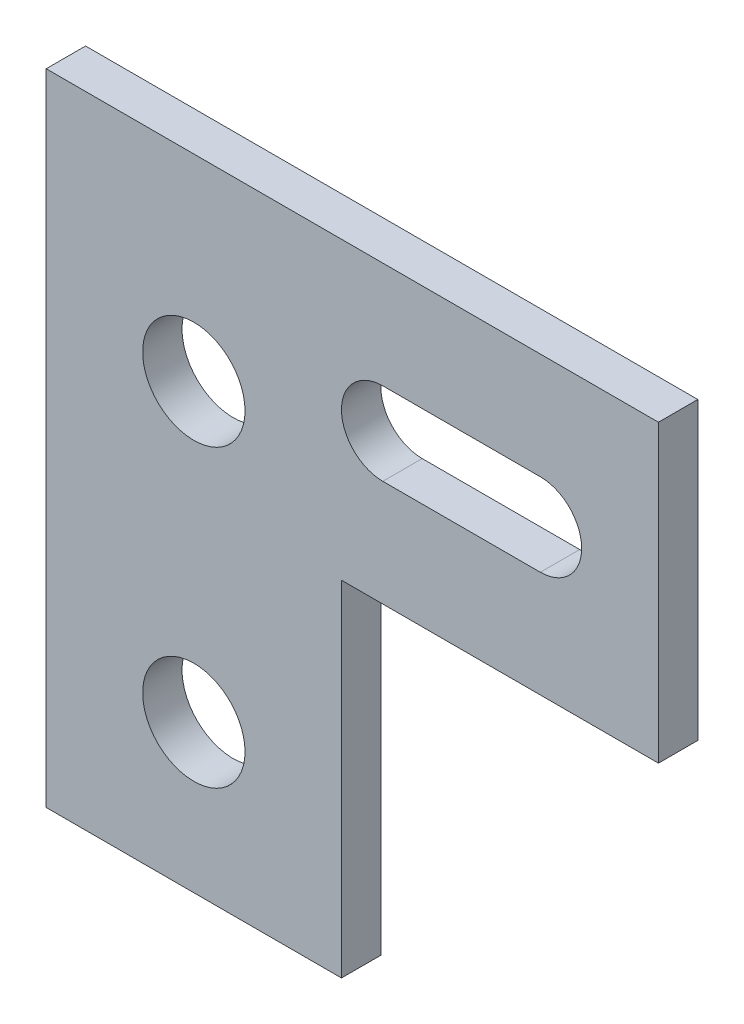
ISO-10303-21;
HEADER;
FILE_DESCRIPTION(('STEP AP214'),'2;1');
FILE_NAME('part.step','',(''),(''),'','','');
FILE_SCHEMA(('AUTOMOTIVE_DESIGN { 1 0 10303 214 1 1 1 1 }'));
ENDSEC;
DATA;
#1=APPLICATION_CONTEXT('core data for automotive mechanical design processes');
#2=APPLICATION_PROTOCOL_DEFINITION('international standard','automotive_design',2000,#1);
#3=PRODUCT_CONTEXT('',#1,'mechanical');
#4=PRODUCT('Part','Part','',(#3));
#5=PRODUCT_RELATED_PRODUCT_CATEGORY('part','',(#4));
#6=PRODUCT_DEFINITION_FORMATION('','',#4);
#7=PRODUCT_DEFINITION_CONTEXT('part definition',#1,'design');
#8=PRODUCT_DEFINITION('design','',#6,#7);
#9=PRODUCT_DEFINITION_SHAPE('','',#8);
#10=(LENGTH_UNIT() NAMED_UNIT(*) SI_UNIT(.MILLI.,.METRE.));
#11=(NAMED_UNIT(*) PLANE_ANGLE_UNIT() SI_UNIT($,.RADIAN.));
#12=(NAMED_UNIT(*) SI_UNIT($,.STERADIAN.) SOLID_ANGLE_UNIT());
#13=UNCERTAINTY_MEASURE_WITH_UNIT(LENGTH_MEASURE(1.E-05),#10,'distance_accuracy_value','');
#14=(GEOMETRIC_REPRESENTATION_CONTEXT(3) GLOBAL_UNCERTAINTY_ASSIGNED_CONTEXT((#13)) GLOBAL_UNIT_ASSIGNED_CONTEXT((#10,
#11,#12)) REPRESENTATION_CONTEXT('',''));
#15=CARTESIAN_POINT('',(0.,0.,0.));
#16=DIRECTION('',(0.,0.,1.));
#17=DIRECTION('',(1.,0.,0.));
#18=AXIS2_PLACEMENT_3D('',#15,#16,#17);
#19=CARTESIAN_POINT('',(15.,0.,2.));
#20=DIRECTION('',(-1.,0.,0.));
#21=DIRECTION('',(0.,0.,1.));
#22=AXIS2_PLACEMENT_3D('',#19,#20,#21);
#23=PLANE('',#22);
#24=DIRECTION('',(0.,1.,0.));
#25=VECTOR('',#24,1.);
#26=CARTESIAN_POINT('',(15.,0.,0.));
#27=LINE('',#26,#25);
#28=CARTESIAN_POINT('',(15.,-15.,0.));
#29=VERTEX_POINT('',#28);
#30=CARTESIAN_POINT('',(15.,2.49999999999999,0.));
#31=VERTEX_POINT('',#30);
#32=EDGE_CURVE('E188',#29,#31,#27,.T.);
#33=ORIENTED_EDGE('',*,*,#32,.T.);
#34=DIRECTION('',(0.,0.,-1.));
#35=VECTOR('',#34,1.);
#36=CARTESIAN_POINT('',(15.,2.49999999999999,2.));
#37=LINE('',#36,#35);
#38=CARTESIAN_POINT('',(15.,2.49999999999999,2.));
#39=VERTEX_POINT('',#38);
#40=EDGE_CURVE('E11',#39,#31,#37,.T.);
#41=ORIENTED_EDGE('',*,*,#40,.F.);
#42=DIRECTION('',(0.,1.,0.));
#43=VECTOR('',#42,1.);
#44=CARTESIAN_POINT('',(15.,0.,2.));
#45=LINE('',#44,#43);
#46=CARTESIAN_POINT('',(15.,-15.,2.));
#47=VERTEX_POINT('',#46);
#48=EDGE_CURVE('E263',#47,#39,#45,.T.);
#49=ORIENTED_EDGE('',*,*,#48,.F.);
#50=DIRECTION('',(0.,0.,-1.));
#51=VECTOR('',#50,1.);
#52=CARTESIAN_POINT('',(15.,-15.,2.));
#53=LINE('',#52,#51);
#54=EDGE_CURVE('E65',#47,#29,#53,.T.);
#55=ORIENTED_EDGE('',*,*,#54,.T.);
#56=EDGE_LOOP('',(#33,#41,#49,#55));
#57=FACE_BOUND('',#56,.T.);
#58=ADVANCED_FACE('F45',(#57),#23,.F.);
#59=CARTESIAN_POINT('',(0.,2.49999999999999,2.));
#60=DIRECTION('',(0.,1.,0.));
#61=DIRECTION('',(0.,0.,1.));
#62=AXIS2_PLACEMENT_3D('',#59,#60,#61);
#63=PLANE('',#62);
#64=DIRECTION('',(1.,0.,0.));
#65=VECTOR('',#64,1.);
#66=CARTESIAN_POINT('',(0.,2.49999999999999,0.));
#67=LINE('',#66,#65);
#68=CARTESIAN_POINT('',(31.1,2.49999999999999,0.));
#69=VERTEX_POINT('',#68);
#70=EDGE_CURVE('E191',#31,#69,#67,.T.);
#71=ORIENTED_EDGE('',*,*,#70,.T.);
#72=DIRECTION('',(0.,0.,-1.));
#73=VECTOR('',#72,1.);
#74=CARTESIAN_POINT('',(31.1,2.49999999999999,2.));
#75=LINE('',#74,#73);
#76=CARTESIAN_POINT('',(31.1,2.49999999999999,2.));
#77=VERTEX_POINT('',#76);
#78=EDGE_CURVE('E56',#77,#69,#75,.T.);
#79=ORIENTED_EDGE('',*,*,#78,.F.);
#80=DIRECTION('',(1.,0.,0.));
#81=VECTOR('',#80,1.);
#82=CARTESIAN_POINT('',(0.,2.49999999999999,2.));
#83=LINE('',#82,#81);
#84=EDGE_CURVE('E266',#39,#77,#83,.T.);
#85=ORIENTED_EDGE('',*,*,#84,.F.);
#86=ORIENTED_EDGE('',*,*,#40,.T.);
#87=EDGE_LOOP('',(#71,#79,#85,#86));
#88=FACE_BOUND('',#87,.T.);
#89=ADVANCED_FACE('F289',(#88),#63,.F.);
#90=CARTESIAN_POINT('',(31.1,0.,2.));
#91=DIRECTION('',(1.,0.,0.));
#92=DIRECTION('',(0.,0.,-1.));
#93=AXIS2_PLACEMENT_3D('',#90,#91,#92);
#94=PLANE('',#93);
#95=DIRECTION('',(0.,-1.,0.));
#96=VECTOR('',#95,1.);
#97=CARTESIAN_POINT('',(31.1,0.,0.));
#98=LINE('',#97,#96);
#99=CARTESIAN_POINT('',(31.1,17.5,0.));
#100=VERTEX_POINT('',#99);
#101=EDGE_CURVE('E195',#100,#69,#98,.T.);
#102=ORIENTED_EDGE('',*,*,#101,.F.);
#103=DIRECTION('',(0.,0.,-1.));
#104=VECTOR('',#103,1.);
#105=CARTESIAN_POINT('',(31.1,17.5,2.));
#106=LINE('',#105,#104);
#107=CARTESIAN_POINT('',(31.1,17.5,2.));
#108=VERTEX_POINT('',#107);
#109=EDGE_CURVE('E141',#108,#100,#106,.T.);
#110=ORIENTED_EDGE('',*,*,#109,.F.);
#111=DIRECTION('',(0.,-1.,0.));
#112=VECTOR('',#111,1.);
#113=CARTESIAN_POINT('',(31.1,0.,2.));
#114=LINE('',#113,#112);
#115=EDGE_CURVE('E152',#108,#77,#114,.T.);
#116=ORIENTED_EDGE('',*,*,#115,.T.);
#117=ORIENTED_EDGE('',*,*,#78,.T.);
#118=EDGE_LOOP('',(#102,#110,#116,#117));
#119=FACE_BOUND('',#118,.T.);
#120=ADVANCED_FACE('F271',(#119),#94,.T.);
#121=CARTESIAN_POINT('',(0.,17.5,2.));
#122=DIRECTION('',(0.,1.,0.));
#123=DIRECTION('',(0.,0.,1.));
#124=AXIS2_PLACEMENT_3D('',#121,#122,#123);
#125=PLANE('',#124);
#126=DIRECTION('',(1.,0.,0.));
#127=VECTOR('',#126,1.);
#128=CARTESIAN_POINT('',(0.,17.5,0.));
#129=LINE('',#128,#127);
#130=CARTESIAN_POINT('',(0.,17.5,0.));
#131=VERTEX_POINT('',#130);
#132=EDGE_CURVE('E136',#131,#100,#129,.T.);
#133=ORIENTED_EDGE('',*,*,#132,.F.);
#134=DIRECTION('',(0.,0.,-1.));
#135=VECTOR('',#134,1.);
#136=CARTESIAN_POINT('',(0.,17.5,2.));
#137=LINE('',#136,#135);
#138=CARTESIAN_POINT('',(0.,17.5,2.));
#139=VERTEX_POINT('',#138);
#140=EDGE_CURVE('E131',#139,#131,#137,.T.);
#141=ORIENTED_EDGE('',*,*,#140,.F.);
#142=DIRECTION('',(1.,0.,0.));
#143=VECTOR('',#142,1.);
#144=CARTESIAN_POINT('',(0.,17.5,2.));
#145=LINE('',#144,#143);
#146=EDGE_CURVE('E134',#139,#108,#145,.T.);
#147=ORIENTED_EDGE('',*,*,#146,.T.);
#148=ORIENTED_EDGE('',*,*,#109,.T.);
#149=EDGE_LOOP('',(#133,#141,#147,#148));
#150=FACE_BOUND('',#149,.T.);
#151=ADVANCED_FACE('F133',(#150),#125,.T.);
#152=CARTESIAN_POINT('',(0.,0.,2.));
#153=DIRECTION('',(-1.,0.,0.));
#154=DIRECTION('',(0.,0.,1.));
#155=AXIS2_PLACEMENT_3D('',#152,#153,#154);
#156=PLANE('',#155);
#157=DIRECTION('',(0.,1.,0.));
#158=VECTOR('',#157,1.);
#159=CARTESIAN_POINT('',(0.,0.,0.));
#160=LINE('',#159,#158);
#161=CARTESIAN_POINT('',(0.,-15.,0.));
#162=VERTEX_POINT('',#161);
#163=EDGE_CURVE('E201',#162,#131,#160,.T.);
#164=ORIENTED_EDGE('',*,*,#163,.F.);
#165=DIRECTION('',(0.,0.,-1.));
#166=VECTOR('',#165,1.);
#167=CARTESIAN_POINT('',(0.,-15.,2.));
#168=LINE('',#167,#166);
#169=CARTESIAN_POINT('',(0.,-15.,2.));
#170=VERTEX_POINT('',#169);
#171=EDGE_CURVE('E97',#170,#162,#168,.T.);
#172=ORIENTED_EDGE('',*,*,#171,.F.);
#173=DIRECTION('',(0.,1.,0.));
#174=VECTOR('',#173,1.);
#175=CARTESIAN_POINT('',(0.,0.,2.));
#176=LINE('',#175,#174);
#177=EDGE_CURVE('E150',#170,#139,#176,.T.);
#178=ORIENTED_EDGE('',*,*,#177,.T.);
#179=ORIENTED_EDGE('',*,*,#140,.T.);
#180=EDGE_LOOP('',(#164,#172,#178,#179));
#181=FACE_BOUND('',#180,.T.);
#182=ADVANCED_FACE('F155',(#181),#156,.T.);
#183=CARTESIAN_POINT('',(25.1,9.99999999999999,2.));
#184=DIRECTION('',(0.,0.,-1.));
#185=DIRECTION('',(-1.,0.,0.));
#186=AXIS2_PLACEMENT_3D('',#183,#184,#185);
#187=CYLINDRICAL_SURFACE('',#186,2.1);
#188=CARTESIAN_POINT('',(25.1,9.99999999999999,0.));
#189=DIRECTION('',(0.,0.,1.));
#190=DIRECTION('',(1.,0.,0.));
#191=AXIS2_PLACEMENT_3D('',#188,#189,#190);
#192=CIRCLE('',#191,2.1);
#193=CARTESIAN_POINT('',(25.1,7.89999999999999,0.));
#194=VERTEX_POINT('',#193);
#195=CARTESIAN_POINT('',(25.1,12.1,0.));
#196=VERTEX_POINT('',#195);
#197=EDGE_CURVE('E168',#194,#196,#192,.T.);
#198=ORIENTED_EDGE('',*,*,#197,.F.);
#199=DIRECTION('',(0.,0.,-1.));
#200=VECTOR('',#199,1.);
#201=CARTESIAN_POINT('',(25.1,7.89999999999999,2.));
#202=LINE('',#201,#200);
#203=CARTESIAN_POINT('',(25.1,7.89999999999999,2.));
#204=VERTEX_POINT('',#203);
#205=EDGE_CURVE('E49',#204,#194,#202,.T.);
#206=ORIENTED_EDGE('',*,*,#205,.F.);
#207=CARTESIAN_POINT('',(25.1,9.99999999999999,2.));
#208=DIRECTION('',(0.,0.,1.));
#209=DIRECTION('',(1.,0.,0.));
#210=AXIS2_PLACEMENT_3D('',#207,#208,#209);
#211=CIRCLE('',#210,2.1);
#212=CARTESIAN_POINT('',(25.1,12.1,2.));
#213=VERTEX_POINT('',#212);
#214=EDGE_CURVE('E212',#204,#213,#211,.T.);
#215=ORIENTED_EDGE('',*,*,#214,.T.);
#216=DIRECTION('',(0.,0.,-1.));
#217=VECTOR('',#216,1.);
#218=CARTESIAN_POINT('',(25.1,12.1,2.));
#219=LINE('',#218,#217);
#220=EDGE_CURVE('E167',#213,#196,#219,.T.);
#221=ORIENTED_EDGE('',*,*,#220,.T.);
#222=EDGE_LOOP('',(#198,#206,#215,#221));
#223=FACE_BOUND('',#222,.T.);
#224=ADVANCED_FACE('F47',(#223),#187,.F.);
#225=CARTESIAN_POINT('',(0.,7.89999999999999,2.));
#226=DIRECTION('',(0.,1.,0.));
#227=DIRECTION('',(0.,0.,1.));
#228=AXIS2_PLACEMENT_3D('',#225,#226,#227);
#229=PLANE('',#228);
#230=DIRECTION('',(1.,0.,0.));
#231=VECTOR('',#230,1.);
#232=CARTESIAN_POINT('',(0.,7.89999999999999,0.));
#233=LINE('',#232,#231);
#234=CARTESIAN_POINT('',(17.1,7.89999999999999,0.));
#235=VERTEX_POINT('',#234);
#236=EDGE_CURVE('E172',#235,#194,#233,.T.);
#237=ORIENTED_EDGE('',*,*,#236,.F.);
#238=DIRECTION('',(0.,0.,-1.));
#239=VECTOR('',#238,1.);
#240=CARTESIAN_POINT('',(17.1,7.89999999999999,2.));
#241=LINE('',#240,#239);
#242=CARTESIAN_POINT('',(17.1,7.89999999999999,2.));
#243=VERTEX_POINT('',#242);
#244=EDGE_CURVE('E225',#243,#235,#241,.T.);
#245=ORIENTED_EDGE('',*,*,#244,.F.);
#246=DIRECTION('',(1.,0.,0.));
#247=VECTOR('',#246,1.);
#248=CARTESIAN_POINT('',(0.,7.89999999999999,2.));
#249=LINE('',#248,#247);
#250=EDGE_CURVE('E236',#243,#204,#249,.T.);
#251=ORIENTED_EDGE('',*,*,#250,.T.);
#252=ORIENTED_EDGE('',*,*,#205,.T.);
#253=EDGE_LOOP('',(#237,#245,#251,#252));
#254=FACE_BOUND('',#253,.T.);
#255=ADVANCED_FACE('F234',(#254),#229,.T.);
#256=CARTESIAN_POINT('',(17.1,9.99999999999999,2.));
#257=DIRECTION('',(0.,0.,-1.));
#258=DIRECTION('',(-1.,0.,0.));
#259=AXIS2_PLACEMENT_3D('',#256,#257,#258);
#260=CYLINDRICAL_SURFACE('',#259,2.1);
#261=CARTESIAN_POINT('',(17.1,9.99999999999999,0.));
#262=DIRECTION('',(0.,0.,1.));
#263=DIRECTION('',(1.,0.,0.));
#264=AXIS2_PLACEMENT_3D('',#261,#262,#263);
#265=CIRCLE('',#264,2.1);
#266=CARTESIAN_POINT('',(17.1,12.1,0.));
#267=VERTEX_POINT('',#266);
#268=EDGE_CURVE('E176',#267,#235,#265,.T.);
#269=ORIENTED_EDGE('',*,*,#268,.F.);
#270=DIRECTION('',(0.,0.,-1.));
#271=VECTOR('',#270,1.);
#272=CARTESIAN_POINT('',(17.1,12.1,2.));
#273=LINE('',#272,#271);
#274=CARTESIAN_POINT('',(17.1,12.1,2.));
#275=VERTEX_POINT('',#274);
#276=EDGE_CURVE('E223',#275,#267,#273,.T.);
#277=ORIENTED_EDGE('',*,*,#276,.F.);
#278=CARTESIAN_POINT('',(17.1,9.99999999999999,2.));
#279=DIRECTION('',(0.,0.,1.));
#280=DIRECTION('',(1.,0.,0.));
#281=AXIS2_PLACEMENT_3D('',#278,#279,#280);
#282=CIRCLE('',#281,2.1);
#283=EDGE_CURVE('E245',#275,#243,#282,.T.);
#284=ORIENTED_EDGE('',*,*,#283,.T.);
#285=ORIENTED_EDGE('',*,*,#244,.T.);
#286=EDGE_LOOP('',(#269,#277,#284,#285));
#287=FACE_BOUND('',#286,.T.);
#288=ADVANCED_FACE('F242',(#287),#260,.F.);
#289=CARTESIAN_POINT('',(0.,-15.,2.));
#290=DIRECTION('',(0.,-1.,0.));
#291=DIRECTION('',(1.,0.,0.));
#292=AXIS2_PLACEMENT_3D('',#289,#290,#291);
#293=PLANE('',#292);
#294=DIRECTION('',(-1.,0.,0.));
#295=VECTOR('',#294,1.);
#296=CARTESIAN_POINT('',(0.,-15.,0.));
#297=LINE('',#296,#295);
#298=EDGE_CURVE('E204',#29,#162,#297,.T.);
#299=ORIENTED_EDGE('',*,*,#298,.F.);
#300=ORIENTED_EDGE('',*,*,#54,.F.);
#301=DIRECTION('',(-1.,0.,0.));
#302=VECTOR('',#301,1.);
#303=CARTESIAN_POINT('',(0.,-15.,2.));
#304=LINE('',#303,#302);
#305=EDGE_CURVE('E157',#47,#170,#304,.T.);
#306=ORIENTED_EDGE('',*,*,#305,.T.);
#307=ORIENTED_EDGE('',*,*,#171,.T.);
#308=EDGE_LOOP('',(#299,#300,#306,#307));
#309=FACE_BOUND('',#308,.T.);
#310=ADVANCED_FACE('F275',(#309),#293,.T.);
#311=CARTESIAN_POINT('',(7.5,7.5,2.));
#312=DIRECTION('',(0.,0.,-1.));
#313=DIRECTION('',(-1.,0.,0.));
#314=AXIS2_PLACEMENT_3D('',#311,#312,#313);
#315=CYLINDRICAL_SURFACE('',#314,2.6);
#316=CARTESIAN_POINT('',(7.5,7.5,2.));
#317=DIRECTION('',(0.,0.,1.));
#318=DIRECTION('',(1.,0.,0.));
#319=AXIS2_PLACEMENT_3D('',#316,#317,#318);
#320=CIRCLE('',#319,2.6);
#321=CARTESIAN_POINT('',(10.1,7.5,2.));
#322=VERTEX_POINT('',#321);
#323=EDGE_CURVE('E251',#322,#322,#320,.T.);
#324=ORIENTED_EDGE('',*,*,#323,.T.);
#325=EDGE_LOOP('',(#324));
#326=FACE_BOUND('',#325,.T.);
#327=CARTESIAN_POINT('',(7.5,7.5,0.));
#328=DIRECTION('',(0.,0.,1.));
#329=DIRECTION('',(1.,0.,0.));
#330=AXIS2_PLACEMENT_3D('',#327,#328,#329);
#331=CIRCLE('',#330,2.6);
#332=CARTESIAN_POINT('',(10.1,7.5,0.));
#333=VERTEX_POINT('',#332);
#334=EDGE_CURVE('E184',#333,#333,#331,.T.);
#335=ORIENTED_EDGE('',*,*,#334,.F.);
#336=EDGE_LOOP('',(#335));
#337=FACE_BOUND('',#336,.T.);
#338=ADVANCED_FACE('F277',(#326,#337),#315,.F.);
#339=CARTESIAN_POINT('',(0.,12.1,2.));
#340=DIRECTION('',(0.,1.,0.));
#341=DIRECTION('',(0.,0.,1.));
#342=AXIS2_PLACEMENT_3D('',#339,#340,#341);
#343=PLANE('',#342);
#344=DIRECTION('',(1.,0.,0.));
#345=VECTOR('',#344,1.);
#346=CARTESIAN_POINT('',(0.,12.1,0.));
#347=LINE('',#346,#345);
#348=EDGE_CURVE('E180',#267,#196,#347,.T.);
#349=ORIENTED_EDGE('',*,*,#348,.T.);
#350=ORIENTED_EDGE('',*,*,#220,.F.);
#351=DIRECTION('',(1.,0.,0.));
#352=VECTOR('',#351,1.);
#353=CARTESIAN_POINT('',(0.,12.1,2.));
#354=LINE('',#353,#352);
#355=EDGE_CURVE('E247',#275,#213,#354,.T.);
#356=ORIENTED_EDGE('',*,*,#355,.F.);
#357=ORIENTED_EDGE('',*,*,#276,.T.);
#358=EDGE_LOOP('',(#349,#350,#356,#357));
#359=FACE_BOUND('',#358,.T.);
#360=ADVANCED_FACE('F248',(#359),#343,.F.);
#361=CARTESIAN_POINT('',(7.5,-7.5,2.));
#362=DIRECTION('',(0.,0.,-1.));
#363=DIRECTION('',(-1.,0.,0.));
#364=AXIS2_PLACEMENT_3D('',#361,#362,#363);
#365=CYLINDRICAL_SURFACE('',#364,2.6);
#366=CARTESIAN_POINT('',(7.5,-7.5,2.));
#367=DIRECTION('',(0.,0.,1.));
#368=DIRECTION('',(1.,0.,0.));
#369=AXIS2_PLACEMENT_3D('',#366,#367,#368);
#370=CIRCLE('',#369,2.6);
#371=CARTESIAN_POINT('',(10.1,-7.5,2.));
#372=VERTEX_POINT('',#371);
#373=EDGE_CURVE('E160',#372,#372,#370,.F.);
#374=ORIENTED_EDGE('',*,*,#373,.F.);
#375=EDGE_LOOP('',(#374));
#376=FACE_BOUND('',#375,.T.);
#377=CARTESIAN_POINT('',(7.5,-7.5,0.));
#378=DIRECTION('',(0.,0.,1.));
#379=DIRECTION('',(1.,0.,0.));
#380=AXIS2_PLACEMENT_3D('',#377,#378,#379);
#381=CIRCLE('',#380,2.6);
#382=CARTESIAN_POINT('',(10.1,-7.5,0.));
#383=VERTEX_POINT('',#382);
#384=EDGE_CURVE('E208',#383,#383,#381,.F.);
#385=ORIENTED_EDGE('',*,*,#384,.T.);
#386=EDGE_LOOP('',(#385));
#387=FACE_BOUND('',#386,.T.);
#388=ADVANCED_FACE('F299',(#376,#387),#365,.F.);
#389=CARTESIAN_POINT('',(0.,0.,2.));
#390=DIRECTION('',(0.,0.,1.));
#391=DIRECTION('',(1.,0.,0.));
#392=AXIS2_PLACEMENT_3D('',#389,#390,#391);
#393=PLANE('',#392);
#394=ORIENTED_EDGE('',*,*,#214,.F.);
#395=ORIENTED_EDGE('',*,*,#250,.F.);
#396=ORIENTED_EDGE('',*,*,#283,.F.);
#397=ORIENTED_EDGE('',*,*,#355,.T.);
#398=EDGE_LOOP('',(#394,#395,#396,#397));
#399=FACE_BOUND('',#398,.T.);
#400=ORIENTED_EDGE('',*,*,#323,.F.);
#401=EDGE_LOOP('',(#400));
#402=FACE_BOUND('',#401,.T.);
#403=ORIENTED_EDGE('',*,*,#48,.T.);
#404=ORIENTED_EDGE('',*,*,#84,.T.);
#405=ORIENTED_EDGE('',*,*,#115,.F.);
#406=ORIENTED_EDGE('',*,*,#146,.F.);
#407=ORIENTED_EDGE('',*,*,#177,.F.);
#408=ORIENTED_EDGE('',*,*,#305,.F.);
#409=EDGE_LOOP('',(#403,#404,#405,#406,#407,#408));
#410=FACE_BOUND('',#409,.T.);
#411=ORIENTED_EDGE('',*,*,#373,.T.);
#412=EDGE_LOOP('',(#411));
#413=FACE_BOUND('',#412,.T.);
#414=ADVANCED_FACE('F147',(#399,#402,#410,#413),#393,.T.);
#415=CARTESIAN_POINT('',(0.,0.,0.));
#416=DIRECTION('',(0.,0.,1.));
#417=DIRECTION('',(1.,0.,0.));
#418=AXIS2_PLACEMENT_3D('',#415,#416,#417);
#419=PLANE('',#418);
#420=ORIENTED_EDGE('',*,*,#197,.T.);
#421=ORIENTED_EDGE('',*,*,#348,.F.);
#422=ORIENTED_EDGE('',*,*,#268,.T.);
#423=ORIENTED_EDGE('',*,*,#236,.T.);
#424=EDGE_LOOP('',(#420,#421,#422,#423));
#425=FACE_BOUND('',#424,.T.);
#426=ORIENTED_EDGE('',*,*,#334,.T.);
#427=EDGE_LOOP('',(#426));
#428=FACE_BOUND('',#427,.T.);
#429=ORIENTED_EDGE('',*,*,#32,.F.);
#430=ORIENTED_EDGE('',*,*,#298,.T.);
#431=ORIENTED_EDGE('',*,*,#163,.T.);
#432=ORIENTED_EDGE('',*,*,#132,.T.);
#433=ORIENTED_EDGE('',*,*,#101,.T.);
#434=ORIENTED_EDGE('',*,*,#70,.F.);
#435=EDGE_LOOP('',(#429,#430,#431,#432,#433,#434));
#436=FACE_BOUND('',#435,.T.);
#437=ORIENTED_EDGE('',*,*,#384,.F.);
#438=EDGE_LOOP('',(#437));
#439=FACE_BOUND('',#438,.T.);
#440=ADVANCED_FACE('F240',(#425,#428,#436,#439),#419,.F.);
#441=CLOSED_SHELL('',(#58,#89,#120,#151,#182,#224,#255,#288,#310,#338,#360,#388,#414,#440));
#442=MANIFOLD_SOLID_BREP('B2',#441);
#443=ADVANCED_BREP_SHAPE_REPRESENTATION('',(#18,#442),#14);
#444=SHAPE_DEFINITION_REPRESENTATION(#9,#443);
ENDSEC;
END-ISO-10303-21;
